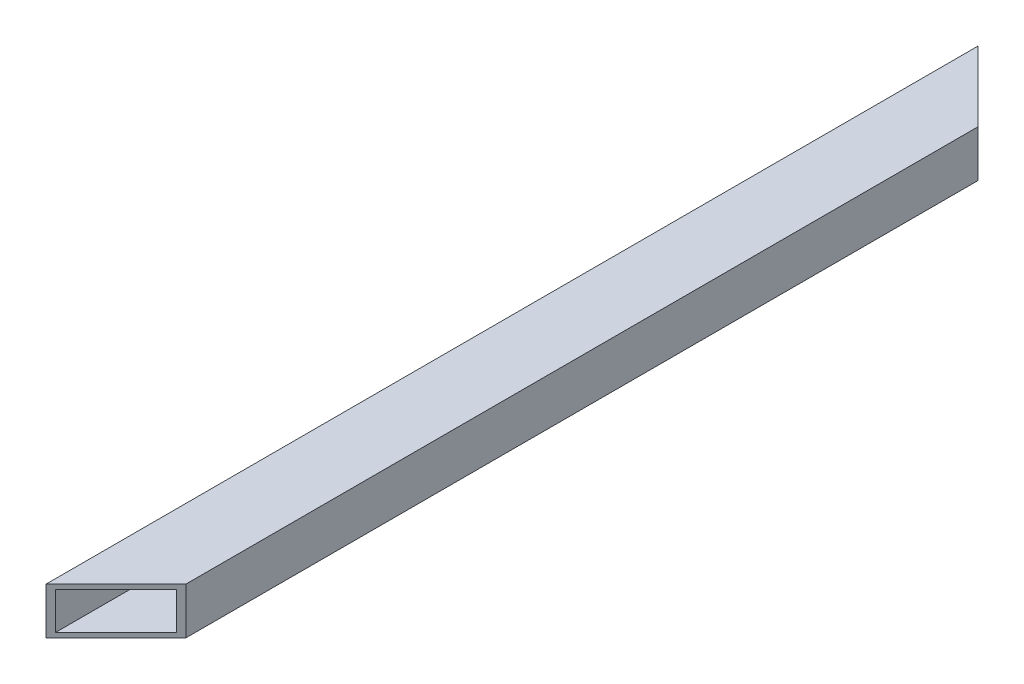
ISO-10303-21;
HEADER;
FILE_DESCRIPTION(('STEP AP214'),'2;1');
FILE_NAME('part.step','',(''),(''),'','','');
FILE_SCHEMA(('AUTOMOTIVE_DESIGN { 1 0 10303 214 1 1 1 1 }'));
ENDSEC;
DATA;
#1=APPLICATION_CONTEXT('core data for automotive mechanical design processes');
#2=APPLICATION_PROTOCOL_DEFINITION('international standard','automotive_design',2000,#1);
#3=PRODUCT_CONTEXT('',#1,'mechanical');
#4=PRODUCT('Part','Part','',(#3));
#5=PRODUCT_RELATED_PRODUCT_CATEGORY('part','',(#4));
#6=PRODUCT_DEFINITION_FORMATION('','',#4);
#7=PRODUCT_DEFINITION_CONTEXT('part definition',#1,'design');
#8=PRODUCT_DEFINITION('design','',#6,#7);
#9=PRODUCT_DEFINITION_SHAPE('','',#8);
#10=(LENGTH_UNIT() NAMED_UNIT(*) SI_UNIT(.MILLI.,.METRE.));
#11=(NAMED_UNIT(*) PLANE_ANGLE_UNIT() SI_UNIT($,.RADIAN.));
#12=(NAMED_UNIT(*) SI_UNIT($,.STERADIAN.) SOLID_ANGLE_UNIT());
#13=UNCERTAINTY_MEASURE_WITH_UNIT(LENGTH_MEASURE(1.E-05),#10,'distance_accuracy_value','');
#14=(GEOMETRIC_REPRESENTATION_CONTEXT(3) GLOBAL_UNCERTAINTY_ASSIGNED_CONTEXT((#13)) GLOBAL_UNIT_ASSIGNED_CONTEXT((#10,
#11,#12)) REPRESENTATION_CONTEXT('',''));
#15=CARTESIAN_POINT('',(0.,0.,0.));
#16=DIRECTION('',(0.,0.,1.));
#17=DIRECTION('',(1.,0.,0.));
#18=AXIS2_PLACEMENT_3D('',#15,#16,#17);
#19=CARTESIAN_POINT('',(13.,8.,400.));
#20=DIRECTION('',(0.,-1.,0.));
#21=DIRECTION('',(0.,0.,-1.));
#22=AXIS2_PLACEMENT_3D('',#19,#20,#21);
#23=PLANE('',#22);
#24=DIRECTION('',(-0.707106781186552,0.,-0.707106781186543));
#25=VECTOR('',#24,1.);
#26=CARTESIAN_POINT('',(199.,8.,213.999999999998));
#27=LINE('',#26,#25);
#28=CARTESIAN_POINT('',(13.,8.,27.9999999999997));
#29=VERTEX_POINT('',#28);
#30=CARTESIAN_POINT('',(-13.,8.,2.00000000000003));
#31=VERTEX_POINT('',#30);
#32=EDGE_CURVE('E11',#29,#31,#27,.T.);
#33=ORIENTED_EDGE('',*,*,#32,.F.);
#34=DIRECTION('',(0.,0.,-1.));
#35=VECTOR('',#34,1.);
#36=CARTESIAN_POINT('',(13.,8.,400.));
#37=LINE('',#36,#35);
#38=CARTESIAN_POINT('',(13.,8.,372.));
#39=VERTEX_POINT('',#38);
#40=EDGE_CURVE('E148',#39,#29,#37,.T.);
#41=ORIENTED_EDGE('',*,*,#40,.F.);
#42=DIRECTION('',(0.707106781186551,0.,-0.707106781186544));
#43=VECTOR('',#42,1.);
#44=CARTESIAN_POINT('',(-0.999999999999857,8.,386.));
#45=LINE('',#44,#43);
#46=CARTESIAN_POINT('',(-13.,8.,398.));
#47=VERTEX_POINT('',#46);
#48=EDGE_CURVE('E43',#47,#39,#45,.T.);
#49=ORIENTED_EDGE('',*,*,#48,.F.);
#50=DIRECTION('',(0.,0.,-1.));
#51=VECTOR('',#50,1.);
#52=CARTESIAN_POINT('',(-13.,8.,400.));
#53=LINE('',#52,#51);
#54=EDGE_CURVE('E153',#47,#31,#53,.T.);
#55=ORIENTED_EDGE('',*,*,#54,.T.);
#56=EDGE_LOOP('',(#33,#41,#49,#55));
#57=FACE_BOUND('',#56,.T.);
#58=ADVANCED_FACE('F35',(#57),#23,.T.);
#59=CARTESIAN_POINT('',(13.,-8.,400.));
#60=DIRECTION('',(-1.,0.,0.));
#61=DIRECTION('',(0.,0.,1.));
#62=AXIS2_PLACEMENT_3D('',#59,#60,#61);
#63=PLANE('',#62);
#64=DIRECTION('',(0.,1.,0.));
#65=VECTOR('',#64,1.);
#66=CARTESIAN_POINT('',(13.,-7.99999999999993,27.9999999999996));
#67=LINE('',#66,#65);
#68=CARTESIAN_POINT('',(13.,-8.,27.9999999999996));
#69=VERTEX_POINT('',#68);
#70=EDGE_CURVE('E162',#69,#29,#67,.T.);
#71=ORIENTED_EDGE('',*,*,#70,.F.);
#72=DIRECTION('',(0.,0.,-1.));
#73=VECTOR('',#72,1.);
#74=CARTESIAN_POINT('',(13.,-8.,400.));
#75=LINE('',#74,#73);
#76=CARTESIAN_POINT('',(13.,-8.,372.));
#77=VERTEX_POINT('',#76);
#78=EDGE_CURVE('E128',#77,#69,#75,.T.);
#79=ORIENTED_EDGE('',*,*,#78,.F.);
#80=DIRECTION('',(0.,-1.,0.));
#81=VECTOR('',#80,1.);
#82=CARTESIAN_POINT('',(13.,-8.,372.));
#83=LINE('',#82,#81);
#84=EDGE_CURVE('E137',#39,#77,#83,.T.);
#85=ORIENTED_EDGE('',*,*,#84,.F.);
#86=ORIENTED_EDGE('',*,*,#40,.T.);
#87=EDGE_LOOP('',(#71,#79,#85,#86));
#88=FACE_BOUND('',#87,.T.);
#89=ADVANCED_FACE('F147',(#88),#63,.T.);
#90=CARTESIAN_POINT('',(13.,-8.,400.));
#91=DIRECTION('',(0.,1.,0.));
#92=DIRECTION('',(-1.,0.,0.));
#93=AXIS2_PLACEMENT_3D('',#90,#91,#92);
#94=PLANE('',#93);
#95=DIRECTION('',(0.707106781186552,0.,0.707106781186543));
#96=VECTOR('',#95,1.);
#97=CARTESIAN_POINT('',(199.,-7.99999999999997,213.999999999998));
#98=LINE('',#97,#96);
#99=CARTESIAN_POINT('',(-13.,-8.,2.00000000000003));
#100=VERTEX_POINT('',#99);
#101=EDGE_CURVE('E160',#100,#69,#98,.T.);
#102=ORIENTED_EDGE('',*,*,#101,.F.);
#103=DIRECTION('',(0.,0.,-1.));
#104=VECTOR('',#103,1.);
#105=CARTESIAN_POINT('',(-13.,-8.,400.));
#106=LINE('',#105,#104);
#107=CARTESIAN_POINT('',(-13.,-8.,398.));
#108=VERTEX_POINT('',#107);
#109=EDGE_CURVE('E124',#108,#100,#106,.T.);
#110=ORIENTED_EDGE('',*,*,#109,.F.);
#111=DIRECTION('',(-0.707106781186551,0.,0.707106781186544));
#112=VECTOR('',#111,1.);
#113=CARTESIAN_POINT('',(-0.999999999999855,-8.,386.));
#114=LINE('',#113,#112);
#115=EDGE_CURVE('E150',#77,#108,#114,.T.);
#116=ORIENTED_EDGE('',*,*,#115,.F.);
#117=ORIENTED_EDGE('',*,*,#78,.T.);
#118=EDGE_LOOP('',(#102,#110,#116,#117));
#119=FACE_BOUND('',#118,.T.);
#120=ADVANCED_FACE('F185',(#119),#94,.T.);
#121=CARTESIAN_POINT('',(-13.,-8.,400.));
#122=DIRECTION('',(1.,0.,0.));
#123=DIRECTION('',(0.,0.,-1.));
#124=AXIS2_PLACEMENT_3D('',#121,#122,#123);
#125=PLANE('',#124);
#126=DIRECTION('',(0.,-1.,0.));
#127=VECTOR('',#126,1.);
#128=CARTESIAN_POINT('',(-13.,-7.99999999999993,1.99999999999995));
#129=LINE('',#128,#127);
#130=EDGE_CURVE('E156',#31,#100,#129,.T.);
#131=ORIENTED_EDGE('',*,*,#130,.F.);
#132=ORIENTED_EDGE('',*,*,#54,.F.);
#133=DIRECTION('',(0.,1.,0.));
#134=VECTOR('',#133,1.);
#135=CARTESIAN_POINT('',(-13.,-8.,398.));
#136=LINE('',#135,#134);
#137=EDGE_CURVE('E58',#108,#47,#136,.T.);
#138=ORIENTED_EDGE('',*,*,#137,.F.);
#139=ORIENTED_EDGE('',*,*,#109,.T.);
#140=EDGE_LOOP('',(#131,#132,#138,#139));
#141=FACE_BOUND('',#140,.T.);
#142=ADVANCED_FACE('F177',(#141),#125,.T.);
#143=CARTESIAN_POINT('',(-15.,-10.,400.));
#144=DIRECTION('',(-0.707106781186544,0.,-0.707106781186551));
#145=DIRECTION('',(-0.707106781186551,0.,0.707106781186544));
#146=AXIS2_PLACEMENT_3D('',#143,#144,#145);
#147=PLANE('',#146);
#148=ORIENTED_EDGE('',*,*,#137,.T.);
#149=ORIENTED_EDGE('',*,*,#48,.T.);
#150=ORIENTED_EDGE('',*,*,#84,.T.);
#151=ORIENTED_EDGE('',*,*,#115,.T.);
#152=EDGE_LOOP('',(#148,#149,#150,#151));
#153=FACE_BOUND('',#152,.T.);
#154=DIRECTION('',(-0.707106781186551,0.,0.707106781186544));
#155=VECTOR('',#154,1.);
#156=CARTESIAN_POINT('',(-15.,10.,400.));
#157=LINE('',#156,#155);
#158=CARTESIAN_POINT('',(15.,10.,370.));
#159=VERTEX_POINT('',#158);
#160=CARTESIAN_POINT('',(-15.,10.,400.));
#161=VERTEX_POINT('',#160);
#162=EDGE_CURVE('E167',#159,#161,#157,.T.);
#163=ORIENTED_EDGE('',*,*,#162,.T.);
#164=DIRECTION('',(0.,-1.,0.));
#165=VECTOR('',#164,1.);
#166=CARTESIAN_POINT('',(-15.,-10.,400.));
#167=LINE('',#166,#165);
#168=CARTESIAN_POINT('',(-15.,-10.,400.));
#169=VERTEX_POINT('',#168);
#170=EDGE_CURVE('E123',#161,#169,#167,.T.);
#171=ORIENTED_EDGE('',*,*,#170,.T.);
#172=DIRECTION('',(-0.707106781186551,0.,0.707106781186544));
#173=VECTOR('',#172,1.);
#174=CARTESIAN_POINT('',(-15.,-10.,400.));
#175=LINE('',#174,#173);
#176=CARTESIAN_POINT('',(15.,-10.,370.));
#177=VERTEX_POINT('',#176);
#178=EDGE_CURVE('E115',#177,#169,#175,.T.);
#179=ORIENTED_EDGE('',*,*,#178,.F.);
#180=DIRECTION('',(0.,1.,0.));
#181=VECTOR('',#180,1.);
#182=CARTESIAN_POINT('',(15.,-10.,370.));
#183=LINE('',#182,#181);
#184=EDGE_CURVE('E50',#177,#159,#183,.T.);
#185=ORIENTED_EDGE('',*,*,#184,.T.);
#186=EDGE_LOOP('',(#163,#171,#179,#185));
#187=FACE_BOUND('',#186,.T.);
#188=ADVANCED_FACE('F136',(#153,#187),#147,.F.);
#189=CARTESIAN_POINT('',(-15.,-10.,0.));
#190=DIRECTION('',(-0.707106781186543,0.,0.707106781186552));
#191=DIRECTION('',(0.707106781186552,0.,0.707106781186543));
#192=AXIS2_PLACEMENT_3D('',#189,#190,#191);
#193=PLANE('',#192);
#194=ORIENTED_EDGE('',*,*,#130,.T.);
#195=ORIENTED_EDGE('',*,*,#101,.T.);
#196=ORIENTED_EDGE('',*,*,#70,.T.);
#197=ORIENTED_EDGE('',*,*,#32,.T.);
#198=EDGE_LOOP('',(#194,#195,#196,#197));
#199=FACE_BOUND('',#198,.T.);
#200=DIRECTION('',(0.707106781186552,0.,0.707106781186543));
#201=VECTOR('',#200,1.);
#202=CARTESIAN_POINT('',(-15.,10.,0.));
#203=LINE('',#202,#201);
#204=CARTESIAN_POINT('',(-15.,10.,0.));
#205=VERTEX_POINT('',#204);
#206=CARTESIAN_POINT('',(15.,10.,29.9999999999996));
#207=VERTEX_POINT('',#206);
#208=EDGE_CURVE('E109',#205,#207,#203,.T.);
#209=ORIENTED_EDGE('',*,*,#208,.T.);
#210=DIRECTION('',(0.,1.,0.));
#211=VECTOR('',#210,1.);
#212=CARTESIAN_POINT('',(15.,-10.,29.9999999999996));
#213=LINE('',#212,#211);
#214=CARTESIAN_POINT('',(15.,-10.,29.9999999999996));
#215=VERTEX_POINT('',#214);
#216=EDGE_CURVE('E105',#215,#207,#213,.T.);
#217=ORIENTED_EDGE('',*,*,#216,.F.);
#218=DIRECTION('',(0.707106781186552,0.,0.707106781186543));
#219=VECTOR('',#218,1.);
#220=CARTESIAN_POINT('',(-15.,-10.,0.));
#221=LINE('',#220,#219);
#222=CARTESIAN_POINT('',(-15.,-10.,0.));
#223=VERTEX_POINT('',#222);
#224=EDGE_CURVE('E98',#223,#215,#221,.T.);
#225=ORIENTED_EDGE('',*,*,#224,.F.);
#226=DIRECTION('',(0.,-1.,0.));
#227=VECTOR('',#226,1.);
#228=CARTESIAN_POINT('',(-15.,-10.,0.));
#229=LINE('',#228,#227);
#230=EDGE_CURVE('E102',#205,#223,#229,.T.);
#231=ORIENTED_EDGE('',*,*,#230,.F.);
#232=EDGE_LOOP('',(#209,#217,#225,#231));
#233=FACE_BOUND('',#232,.T.);
#234=ADVANCED_FACE('F100',(#199,#233),#193,.F.);
#235=CARTESIAN_POINT('',(-15.,-10.,400.));
#236=DIRECTION('',(1.,0.,0.));
#237=DIRECTION('',(0.,0.,-1.));
#238=AXIS2_PLACEMENT_3D('',#235,#236,#237);
#239=PLANE('',#238);
#240=ORIENTED_EDGE('',*,*,#230,.T.);
#241=DIRECTION('',(0.,0.,-1.));
#242=VECTOR('',#241,1.);
#243=CARTESIAN_POINT('',(-15.,-10.,400.));
#244=LINE('',#243,#242);
#245=EDGE_CURVE('E113',#169,#223,#244,.T.);
#246=ORIENTED_EDGE('',*,*,#245,.F.);
#247=ORIENTED_EDGE('',*,*,#170,.F.);
#248=DIRECTION('',(0.,0.,-1.));
#249=VECTOR('',#248,1.);
#250=CARTESIAN_POINT('',(-15.,10.,400.));
#251=LINE('',#250,#249);
#252=EDGE_CURVE('E122',#161,#205,#251,.T.);
#253=ORIENTED_EDGE('',*,*,#252,.T.);
#254=EDGE_LOOP('',(#240,#246,#247,#253));
#255=FACE_BOUND('',#254,.T.);
#256=ADVANCED_FACE('F37',(#255),#239,.F.);
#257=CARTESIAN_POINT('',(15.,-9.99999999999999,400.));
#258=DIRECTION('',(0.,1.,0.));
#259=DIRECTION('',(-1.,0.,0.));
#260=AXIS2_PLACEMENT_3D('',#257,#258,#259);
#261=PLANE('',#260);
#262=ORIENTED_EDGE('',*,*,#245,.T.);
#263=ORIENTED_EDGE('',*,*,#224,.T.);
#264=DIRECTION('',(0.,0.,-1.));
#265=VECTOR('',#264,1.);
#266=CARTESIAN_POINT('',(15.,-9.99999999999999,400.));
#267=LINE('',#266,#265);
#268=EDGE_CURVE('E118',#177,#215,#267,.T.);
#269=ORIENTED_EDGE('',*,*,#268,.F.);
#270=ORIENTED_EDGE('',*,*,#178,.T.);
#271=EDGE_LOOP('',(#262,#263,#269,#270));
#272=FACE_BOUND('',#271,.T.);
#273=ADVANCED_FACE('F114',(#272),#261,.F.);
#274=CARTESIAN_POINT('',(15.,-9.99999999999999,400.));
#275=DIRECTION('',(-1.,0.,0.));
#276=DIRECTION('',(0.,-1.,0.));
#277=AXIS2_PLACEMENT_3D('',#274,#275,#276);
#278=PLANE('',#277);
#279=ORIENTED_EDGE('',*,*,#268,.T.);
#280=ORIENTED_EDGE('',*,*,#216,.T.);
#281=DIRECTION('',(0.,0.,-1.));
#282=VECTOR('',#281,1.);
#283=CARTESIAN_POINT('',(15.,10.,400.));
#284=LINE('',#283,#282);
#285=EDGE_CURVE('E132',#159,#207,#284,.T.);
#286=ORIENTED_EDGE('',*,*,#285,.F.);
#287=ORIENTED_EDGE('',*,*,#184,.F.);
#288=EDGE_LOOP('',(#279,#280,#286,#287));
#289=FACE_BOUND('',#288,.T.);
#290=ADVANCED_FACE('F174',(#289),#278,.F.);
#291=CARTESIAN_POINT('',(15.,10.,400.));
#292=DIRECTION('',(0.,-1.,0.));
#293=DIRECTION('',(1.,0.,0.));
#294=AXIS2_PLACEMENT_3D('',#291,#292,#293);
#295=PLANE('',#294);
#296=ORIENTED_EDGE('',*,*,#285,.T.);
#297=ORIENTED_EDGE('',*,*,#208,.F.);
#298=ORIENTED_EDGE('',*,*,#252,.F.);
#299=ORIENTED_EDGE('',*,*,#162,.F.);
#300=EDGE_LOOP('',(#296,#297,#298,#299));
#301=FACE_BOUND('',#300,.T.);
#302=ADVANCED_FACE('F175',(#301),#295,.F.);
#303=CLOSED_SHELL('',(#58,#89,#120,#142,#188,#234,#256,#273,#290,#302));
#304=MANIFOLD_SOLID_BREP('B2',#303);
#305=ADVANCED_BREP_SHAPE_REPRESENTATION('',(#18,#304),#14);
#306=SHAPE_DEFINITION_REPRESENTATION(#9,#305);
ENDSEC;
END-ISO-10303-21;
